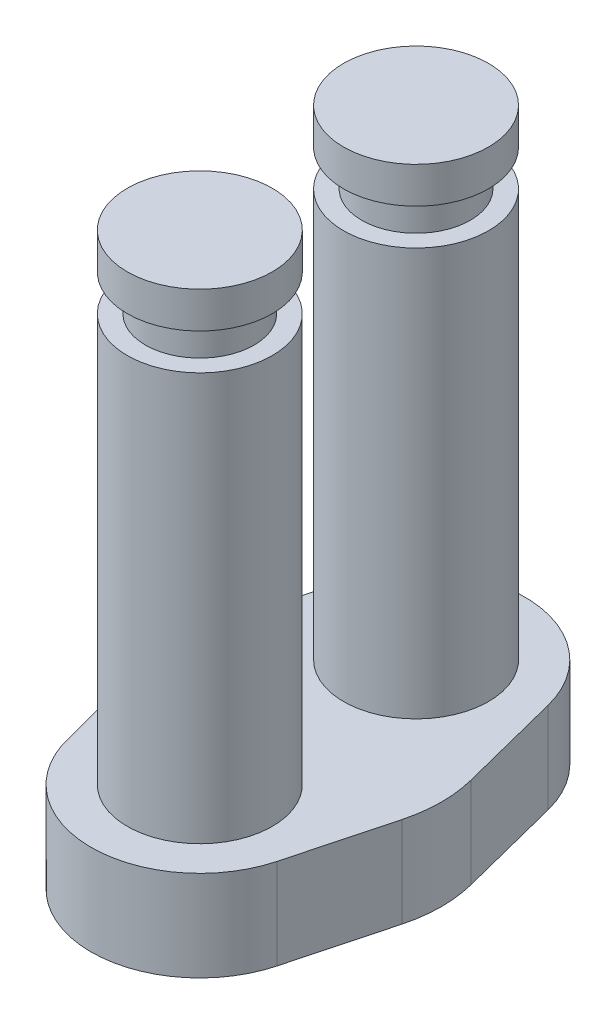
ISO-10303-21;
HEADER;
FILE_DESCRIPTION(('STEP AP214'),'2;1');
FILE_NAME('part.step','',(''),(''),'','','');
FILE_SCHEMA(('AUTOMOTIVE_DESIGN { 1 0 10303 214 1 1 1 1 }'));
ENDSEC;
DATA;
#1=APPLICATION_CONTEXT('core data for automotive mechanical design processes');
#2=APPLICATION_PROTOCOL_DEFINITION('international standard','automotive_design',2000,#1);
#3=PRODUCT_CONTEXT('',#1,'mechanical');
#4=PRODUCT('Part','Part','',(#3));
#5=PRODUCT_RELATED_PRODUCT_CATEGORY('part','',(#4));
#6=PRODUCT_DEFINITION_FORMATION('','',#4);
#7=PRODUCT_DEFINITION_CONTEXT('part definition',#1,'design');
#8=PRODUCT_DEFINITION('design','',#6,#7);
#9=PRODUCT_DEFINITION_SHAPE('','',#8);
#10=(LENGTH_UNIT() NAMED_UNIT(*) SI_UNIT(.MILLI.,.METRE.));
#11=(NAMED_UNIT(*) PLANE_ANGLE_UNIT() SI_UNIT($,.RADIAN.));
#12=(NAMED_UNIT(*) SI_UNIT($,.STERADIAN.) SOLID_ANGLE_UNIT());
#13=UNCERTAINTY_MEASURE_WITH_UNIT(LENGTH_MEASURE(1.E-05),#10,'distance_accuracy_value','');
#14=(GEOMETRIC_REPRESENTATION_CONTEXT(3) GLOBAL_UNCERTAINTY_ASSIGNED_CONTEXT((#13)) GLOBAL_UNIT_ASSIGNED_CONTEXT((#10,
#11,#12)) REPRESENTATION_CONTEXT('',''));
#15=CARTESIAN_POINT('',(0.,0.,0.));
#16=DIRECTION('',(0.,0.,1.));
#17=DIRECTION('',(1.,0.,0.));
#18=AXIS2_PLACEMENT_3D('',#15,#16,#17);
#19=CARTESIAN_POINT('',(10.7914021707681,5.,-2.7425994459952));
#20=DIRECTION('',(-0.969189489495146,0.,0.246316328025849));
#21=DIRECTION('',(0.246316328025849,0.,0.969189489495146));
#22=AXIS2_PLACEMENT_3D('',#19,#20,#21);
#23=PLANE('',#22);
#24=DIRECTION('',(-0.246316328025849,0.,-0.969189489495146));
#25=VECTOR('',#24,1.);
#26=CARTESIAN_POINT('',(10.7914021707681,0.,-2.7425994459952));
#27=LINE('',#26,#25);
#28=CARTESIAN_POINT('',(11.0189211712136,0.,-1.84737246019386));
#29=VERTEX_POINT('',#28);
#30=CARTESIAN_POINT('',(9.56513693697088,0.,-7.56762824313138));
#31=VERTEX_POINT('',#30);
#32=EDGE_CURVE('E132',#29,#31,#27,.T.);
#33=ORIENTED_EDGE('',*,*,#32,.T.);
#34=DIRECTION('',(0.,-1.,0.));
#35=VECTOR('',#34,1.);
#36=CARTESIAN_POINT('',(9.56513693697088,5.,-7.56762824313138));
#37=LINE('',#36,#35);
#38=CARTESIAN_POINT('',(9.56513693697088,5.,-7.56762824313138));
#39=VERTEX_POINT('',#38);
#40=EDGE_CURVE('E37',#39,#31,#37,.T.);
#41=ORIENTED_EDGE('',*,*,#40,.F.);
#42=DIRECTION('',(-0.246316328025849,0.,-0.969189489495146));
#43=VECTOR('',#42,1.);
#44=CARTESIAN_POINT('',(10.7914021707681,5.,-2.7425994459952));
#45=LINE('',#44,#43);
#46=CARTESIAN_POINT('',(11.0189211712136,5.,-1.84737246019386));
#47=VERTEX_POINT('',#46);
#48=EDGE_CURVE('E148',#47,#39,#45,.T.);
#49=ORIENTED_EDGE('',*,*,#48,.F.);
#50=DIRECTION('',(0.,-1.,0.));
#51=VECTOR('',#50,1.);
#52=CARTESIAN_POINT('',(11.0189211712136,5.,-1.84737246019386));
#53=LINE('',#52,#51);
#54=EDGE_CURVE('E128',#47,#29,#53,.T.);
#55=ORIENTED_EDGE('',*,*,#54,.T.);
#56=EDGE_LOOP('',(#33,#41,#49,#55));
#57=FACE_BOUND('',#56,.T.);
#58=ADVANCED_FACE('F34',(#57),#23,.F.);
#59=CARTESIAN_POINT('',(3.75,5.,-6.08973027497629));
#60=DIRECTION('',(0.,-1.,0.));
#61=DIRECTION('',(0.,0.,-1.));
#62=AXIS2_PLACEMENT_3D('',#59,#60,#61);
#63=CYLINDRICAL_SURFACE('',#62,6.);
#64=CARTESIAN_POINT('',(3.75,0.,-6.08973027497629));
#65=DIRECTION('',(0.,1.,0.));
#66=DIRECTION('',(0.,0.,1.));
#67=AXIS2_PLACEMENT_3D('',#64,#65,#66);
#68=CIRCLE('',#67,6.);
#69=CARTESIAN_POINT('',(-2.06513693697088,0.,-7.56762824313138));
#70=VERTEX_POINT('',#69);
#71=EDGE_CURVE('E135',#31,#70,#68,.T.);
#72=ORIENTED_EDGE('',*,*,#71,.T.);
#73=DIRECTION('',(0.,-1.,0.));
#74=VECTOR('',#73,1.);
#75=CARTESIAN_POINT('',(-2.06513693697088,5.,-7.56762824313138));
#76=LINE('',#75,#74);
#77=CARTESIAN_POINT('',(-2.06513693697088,5.,-7.56762824313138));
#78=VERTEX_POINT('',#77);
#79=EDGE_CURVE('E157',#78,#70,#76,.T.);
#80=ORIENTED_EDGE('',*,*,#79,.F.);
#81=CARTESIAN_POINT('',(3.75,5.,-6.08973027497629));
#82=DIRECTION('',(0.,1.,0.));
#83=DIRECTION('',(0.,0.,1.));
#84=AXIS2_PLACEMENT_3D('',#81,#82,#83);
#85=CIRCLE('',#84,6.);
#86=EDGE_CURVE('E92',#39,#78,#85,.T.);
#87=ORIENTED_EDGE('',*,*,#86,.F.);
#88=ORIENTED_EDGE('',*,*,#40,.T.);
#89=EDGE_LOOP('',(#72,#80,#87,#88));
#90=FACE_BOUND('',#89,.T.);
#91=ADVANCED_FACE('F212',(#90),#63,.T.);
#92=CARTESIAN_POINT('',(-3.74644017165911,5.,-0.95214547439252));
#93=DIRECTION('',(0.969189489495147,0.,0.246316328025848));
#94=DIRECTION('',(0.246316328025848,0.,-0.969189489495147));
#95=AXIS2_PLACEMENT_3D('',#92,#93,#94);
#96=PLANE('',#95);
#97=DIRECTION('',(-0.246316328025848,0.,0.969189489495147));
#98=VECTOR('',#97,1.);
#99=CARTESIAN_POINT('',(-3.74644017165911,0.,-0.95214547439252));
#100=LINE('',#99,#98);
#101=CARTESIAN_POINT('',(-3.5189211712136,0.,-1.84737246019386));
#102=VERTEX_POINT('',#101);
#103=EDGE_CURVE('E138',#70,#102,#100,.T.);
#104=ORIENTED_EDGE('',*,*,#103,.T.);
#105=DIRECTION('',(0.,-1.,0.));
#106=VECTOR('',#105,1.);
#107=CARTESIAN_POINT('',(-3.5189211712136,5.,-1.84737246019386));
#108=LINE('',#107,#106);
#109=CARTESIAN_POINT('',(-3.5189211712136,5.,-1.84737246019386));
#110=VERTEX_POINT('',#109);
#111=EDGE_CURVE('E155',#110,#102,#108,.T.);
#112=ORIENTED_EDGE('',*,*,#111,.F.);
#113=DIRECTION('',(-0.246316328025848,0.,0.969189489495147));
#114=VECTOR('',#113,1.);
#115=CARTESIAN_POINT('',(-3.74644017165911,5.,-0.95214547439252));
#116=LINE('',#115,#114);
#117=EDGE_CURVE('E183',#78,#110,#116,.T.);
#118=ORIENTED_EDGE('',*,*,#117,.F.);
#119=ORIENTED_EDGE('',*,*,#79,.T.);
#120=EDGE_LOOP('',(#104,#112,#118,#119));
#121=FACE_BOUND('',#120,.T.);
#122=ADVANCED_FACE('F216',(#121),#96,.F.);
#123=CARTESIAN_POINT('',(3.75,5.,0.));
#124=DIRECTION('',(0.,-1.,0.));
#125=DIRECTION('',(0.,0.,-1.));
#126=AXIS2_PLACEMENT_3D('',#123,#124,#125);
#127=CYLINDRICAL_SURFACE('',#126,7.5);
#128=CARTESIAN_POINT('',(3.75,0.,0.));
#129=DIRECTION('',(0.,1.,0.));
#130=DIRECTION('',(0.,0.,1.));
#131=AXIS2_PLACEMENT_3D('',#128,#129,#130);
#132=CIRCLE('',#131,7.5);
#133=CARTESIAN_POINT('',(-3.49342660554137,0.,1.94493470587972));
#134=VERTEX_POINT('',#133);
#135=EDGE_CURVE('E140',#102,#134,#132,.T.);
#136=ORIENTED_EDGE('',*,*,#135,.T.);
#137=DIRECTION('',(0.,-1.,0.));
#138=VECTOR('',#137,1.);
#139=CARTESIAN_POINT('',(-3.49342660554137,5.,1.94493470587972));
#140=LINE('',#139,#138);
#141=CARTESIAN_POINT('',(-3.49342660554137,5.,1.94493470587972));
#142=VERTEX_POINT('',#141);
#143=EDGE_CURVE('E152',#142,#134,#140,.T.);
#144=ORIENTED_EDGE('',*,*,#143,.F.);
#145=CARTESIAN_POINT('',(3.75,5.,0.));
#146=DIRECTION('',(0.,1.,0.));
#147=DIRECTION('',(0.,0.,1.));
#148=AXIS2_PLACEMENT_3D('',#145,#146,#147);
#149=CIRCLE('',#148,7.5);
#150=EDGE_CURVE('E185',#110,#142,#149,.T.);
#151=ORIENTED_EDGE('',*,*,#150,.F.);
#152=ORIENTED_EDGE('',*,*,#111,.T.);
#153=EDGE_LOOP('',(#136,#144,#151,#152));
#154=FACE_BOUND('',#153,.T.);
#155=ADVANCED_FACE('F190',(#154),#127,.T.);
#156=CARTESIAN_POINT('',(-3.7456113395504,5.,1.00573525290572));
#157=DIRECTION('',(0.965790214072183,0.,-0.259324627450629));
#158=DIRECTION('',(-0.259324627450629,0.,-0.965790214072183));
#159=AXIS2_PLACEMENT_3D('',#156,#157,#158);
#160=PLANE('',#159);
#161=DIRECTION('',(0.259324627450629,0.,0.965790214072183));
#162=VECTOR('',#161,1.);
#163=CARTESIAN_POINT('',(-3.7456113395504,0.,1.00573525290572));
#164=LINE('',#163,#162);
#165=CARTESIAN_POINT('',(-1.92167348288411,0.,7.79853912333431));
#166=VERTEX_POINT('',#165);
#167=EDGE_CURVE('E142',#134,#166,#164,.T.);
#168=ORIENTED_EDGE('',*,*,#167,.T.);
#169=DIRECTION('',(0.,-1.,0.));
#170=VECTOR('',#169,1.);
#171=CARTESIAN_POINT('',(-1.92167348288411,5.,7.79853912333431));
#172=LINE('',#171,#170);
#173=CARTESIAN_POINT('',(-1.92167348288411,5.,7.79853912333431));
#174=VERTEX_POINT('',#173);
#175=EDGE_CURVE('E124',#174,#166,#172,.T.);
#176=ORIENTED_EDGE('',*,*,#175,.F.);
#177=DIRECTION('',(0.259324627450629,0.,0.965790214072183));
#178=VECTOR('',#177,1.);
#179=CARTESIAN_POINT('',(-3.7456113395504,5.,1.00573525290572));
#180=LINE('',#179,#178);
#181=EDGE_CURVE('E111',#142,#174,#180,.T.);
#182=ORIENTED_EDGE('',*,*,#181,.F.);
#183=ORIENTED_EDGE('',*,*,#143,.T.);
#184=EDGE_LOOP('',(#168,#176,#182,#183));
#185=FACE_BOUND('',#184,.T.);
#186=ADVANCED_FACE('F194',(#185),#160,.F.);
#187=CARTESIAN_POINT('',(3.75,5.,5.84095900912463));
#188=DIRECTION('',(0.,-1.,0.));
#189=DIRECTION('',(0.,0.,-1.));
#190=AXIS2_PLACEMENT_3D('',#187,#188,#189);
#191=CYLINDRICAL_SURFACE('',#190,6.);
#192=CARTESIAN_POINT('',(3.75,0.,5.84095900912463));
#193=DIRECTION('',(0.,1.,0.));
#194=DIRECTION('',(0.,0.,1.));
#195=AXIS2_PLACEMENT_3D('',#192,#193,#194);
#196=CIRCLE('',#195,6.);
#197=CARTESIAN_POINT('',(9.54877601505246,0.,7.38180187173338));
#198=VERTEX_POINT('',#197);
#199=EDGE_CURVE('E120',#166,#198,#196,.T.);
#200=ORIENTED_EDGE('',*,*,#199,.T.);
#201=DIRECTION('',(0.,-1.,0.));
#202=VECTOR('',#201,1.);
#203=CARTESIAN_POINT('',(9.54877601505246,5.,7.38180187173338));
#204=LINE('',#203,#202);
#205=CARTESIAN_POINT('',(9.54877601505246,5.,7.38180187173338));
#206=VERTEX_POINT('',#205);
#207=EDGE_CURVE('E117',#206,#198,#204,.T.);
#208=ORIENTED_EDGE('',*,*,#207,.F.);
#209=CARTESIAN_POINT('',(3.75,5.,5.84095900912463));
#210=DIRECTION('',(0.,1.,0.));
#211=DIRECTION('',(0.,0.,1.));
#212=AXIS2_PLACEMENT_3D('',#209,#210,#211);
#213=CIRCLE('',#212,6.);
#214=EDGE_CURVE('E105',#174,#206,#213,.T.);
#215=ORIENTED_EDGE('',*,*,#214,.F.);
#216=ORIENTED_EDGE('',*,*,#175,.T.);
#217=EDGE_LOOP('',(#200,#208,#215,#216));
#218=FACE_BOUND('',#217,.T.);
#219=ADVANCED_FACE('F118',(#218),#191,.T.);
#220=CARTESIAN_POINT('',(10.7511578597268,5.,2.8567830193714));
#221=DIRECTION('',(0.96646266917541,0.,0.256807143768126));
#222=DIRECTION('',(0.256807143768126,0.,-0.96646266917541));
#223=AXIS2_PLACEMENT_3D('',#220,#221,#222);
#224=PLANE('',#223);
#225=DIRECTION('',(-0.256807143768126,0.,0.96646266917541));
#226=VECTOR('',#225,1.);
#227=CARTESIAN_POINT('',(10.7511578597268,0.,2.8567830193714));
#228=LINE('',#227,#226);
#229=CARTESIAN_POINT('',(10.9984700188156,0.,1.92605357826094));
#230=VERTEX_POINT('',#229);
#231=EDGE_CURVE('E145',#230,#198,#228,.T.);
#232=ORIENTED_EDGE('',*,*,#231,.F.);
#233=DIRECTION('',(0.,-1.,0.));
#234=VECTOR('',#233,1.);
#235=CARTESIAN_POINT('',(10.9984700188156,5.,1.92605357826094));
#236=LINE('',#235,#234);
#237=CARTESIAN_POINT('',(10.9984700188156,5.,1.92605357826094));
#238=VERTEX_POINT('',#237);
#239=EDGE_CURVE('E80',#238,#230,#236,.T.);
#240=ORIENTED_EDGE('',*,*,#239,.F.);
#241=DIRECTION('',(-0.256807143768126,0.,0.96646266917541));
#242=VECTOR('',#241,1.);
#243=CARTESIAN_POINT('',(10.7511578597268,5.,2.8567830193714));
#244=LINE('',#243,#242);
#245=EDGE_CURVE('E109',#238,#206,#244,.T.);
#246=ORIENTED_EDGE('',*,*,#245,.T.);
#247=ORIENTED_EDGE('',*,*,#207,.T.);
#248=EDGE_LOOP('',(#232,#240,#246,#247));
#249=FACE_BOUND('',#248,.T.);
#250=ADVANCED_FACE('F126',(#249),#224,.T.);
#251=CARTESIAN_POINT('',(3.75,5.,0.));
#252=DIRECTION('',(0.,-1.,0.));
#253=DIRECTION('',(0.,0.,-1.));
#254=AXIS2_PLACEMENT_3D('',#251,#252,#253);
#255=CYLINDRICAL_SURFACE('',#254,7.5);
#256=CARTESIAN_POINT('',(3.75,0.,0.));
#257=DIRECTION('',(0.,1.,0.));
#258=DIRECTION('',(0.,0.,1.));
#259=AXIS2_PLACEMENT_3D('',#256,#257,#258);
#260=CIRCLE('',#259,7.5);
#261=EDGE_CURVE('E83',#230,#29,#260,.T.);
#262=ORIENTED_EDGE('',*,*,#261,.T.);
#263=ORIENTED_EDGE('',*,*,#54,.F.);
#264=CARTESIAN_POINT('',(3.75,5.,0.));
#265=DIRECTION('',(0.,1.,0.));
#266=DIRECTION('',(0.,0.,1.));
#267=AXIS2_PLACEMENT_3D('',#264,#265,#266);
#268=CIRCLE('',#267,7.5);
#269=EDGE_CURVE('E52',#238,#47,#268,.T.);
#270=ORIENTED_EDGE('',*,*,#269,.F.);
#271=ORIENTED_EDGE('',*,*,#239,.T.);
#272=EDGE_LOOP('',(#262,#263,#270,#271));
#273=FACE_BOUND('',#272,.T.);
#274=ADVANCED_FACE('F200',(#273),#255,.T.);
#275=CARTESIAN_POINT('',(0.,5.,0.));
#276=DIRECTION('',(0.,1.,0.));
#277=DIRECTION('',(0.,0.,1.));
#278=AXIS2_PLACEMENT_3D('',#275,#276,#277);
#279=PLANE('',#278);
#280=CARTESIAN_POINT('',(3.75,5.,-6.08973027497629));
#281=DIRECTION('',(0.,1.,0.));
#282=DIRECTION('',(0.,0.,1.));
#283=AXIS2_PLACEMENT_3D('',#280,#281,#282);
#284=CIRCLE('',#283,4.);
#285=CARTESIAN_POINT('',(3.75,5.,-10.0897302749763));
#286=VERTEX_POINT('',#285);
#287=EDGE_CURVE('E174',#286,#286,#284,.T.);
#288=ORIENTED_EDGE('',*,*,#287,.F.);
#289=EDGE_LOOP('',(#288));
#290=FACE_BOUND('',#289,.T.);
#291=CARTESIAN_POINT('',(3.75,5.,5.84095900912463));
#292=DIRECTION('',(0.,1.,0.));
#293=DIRECTION('',(0.,0.,1.));
#294=AXIS2_PLACEMENT_3D('',#291,#292,#293);
#295=CIRCLE('',#294,4.);
#296=CARTESIAN_POINT('',(3.75,5.,1.84095900912463));
#297=VERTEX_POINT('',#296);
#298=EDGE_CURVE('E173',#297,#297,#295,.T.);
#299=ORIENTED_EDGE('',*,*,#298,.F.);
#300=EDGE_LOOP('',(#299));
#301=FACE_BOUND('',#300,.T.);
#302=ORIENTED_EDGE('',*,*,#48,.T.);
#303=ORIENTED_EDGE('',*,*,#86,.T.);
#304=ORIENTED_EDGE('',*,*,#117,.T.);
#305=ORIENTED_EDGE('',*,*,#150,.T.);
#306=ORIENTED_EDGE('',*,*,#181,.T.);
#307=ORIENTED_EDGE('',*,*,#214,.T.);
#308=ORIENTED_EDGE('',*,*,#245,.F.);
#309=ORIENTED_EDGE('',*,*,#269,.T.);
#310=EDGE_LOOP('',(#302,#303,#304,#305,#306,#307,#308,#309));
#311=FACE_BOUND('',#310,.T.);
#312=ADVANCED_FACE('F107',(#290,#301,#311),#279,.T.);
#313=CARTESIAN_POINT('',(0.,0.,0.));
#314=DIRECTION('',(0.,1.,0.));
#315=DIRECTION('',(0.,0.,1.));
#316=AXIS2_PLACEMENT_3D('',#313,#314,#315);
#317=PLANE('',#316);
#318=CARTESIAN_POINT('',(3.75,0.,-6.08973027497629));
#319=DIRECTION('',(0.,1.,0.));
#320=DIRECTION('',(0.,0.,1.));
#321=AXIS2_PLACEMENT_3D('',#318,#319,#320);
#322=CIRCLE('',#321,1.89865);
#323=CARTESIAN_POINT('',(3.75,0.,-4.19108027497629));
#324=VERTEX_POINT('',#323);
#325=EDGE_CURVE('E424',#324,#324,#322,.T.);
#326=ORIENTED_EDGE('',*,*,#325,.T.);
#327=EDGE_LOOP('',(#326));
#328=FACE_BOUND('',#327,.T.);
#329=CARTESIAN_POINT('',(3.75,0.,5.84095900912463));
#330=DIRECTION('',(0.,1.,0.));
#331=DIRECTION('',(0.,0.,1.));
#332=AXIS2_PLACEMENT_3D('',#329,#330,#331);
#333=CIRCLE('',#332,1.89865);
#334=CARTESIAN_POINT('',(3.75,0.,7.73960900912463));
#335=VERTEX_POINT('',#334);
#336=EDGE_CURVE('E434',#335,#335,#333,.T.);
#337=ORIENTED_EDGE('',*,*,#336,.T.);
#338=EDGE_LOOP('',(#337));
#339=FACE_BOUND('',#338,.T.);
#340=ORIENTED_EDGE('',*,*,#32,.F.);
#341=ORIENTED_EDGE('',*,*,#261,.F.);
#342=ORIENTED_EDGE('',*,*,#231,.T.);
#343=ORIENTED_EDGE('',*,*,#199,.F.);
#344=ORIENTED_EDGE('',*,*,#167,.F.);
#345=ORIENTED_EDGE('',*,*,#135,.F.);
#346=ORIENTED_EDGE('',*,*,#103,.F.);
#347=ORIENTED_EDGE('',*,*,#71,.F.);
#348=EDGE_LOOP('',(#340,#341,#342,#343,#344,#345,#346,#347));
#349=FACE_BOUND('',#348,.T.);
#350=ADVANCED_FACE('F197',(#328,#339,#349),#317,.F.);
#351=CARTESIAN_POINT('',(3.75,27.5,5.84095900912463));
#352=DIRECTION('',(0.,-1.,0.));
#353=DIRECTION('',(0.,0.,-1.));
#354=AXIS2_PLACEMENT_3D('',#351,#352,#353);
#355=CYLINDRICAL_SURFACE('',#354,4.);
#356=CARTESIAN_POINT('',(3.75,27.5,5.84095900912463));
#357=DIRECTION('',(0.,1.,0.));
#358=DIRECTION('',(0.,0.,1.));
#359=AXIS2_PLACEMENT_3D('',#356,#357,#358);
#360=CIRCLE('',#359,4.);
#361=CARTESIAN_POINT('',(3.75,27.5,1.84095900912463));
#362=VERTEX_POINT('',#361);
#363=EDGE_CURVE('E136',#362,#362,#360,.T.);
#364=CARTESIAN_POINT('',(3.75,27.5,1.84095900912463));
#365=CARTESIAN_POINT('',(3.75,27.265625,1.84095900912463));
#366=CARTESIAN_POINT('',(3.75,27.03125,1.84095900912463));
#367=CARTESIAN_POINT('',(3.75,26.5625,1.84095900912463));
#368=CARTESIAN_POINT('',(3.75,26.328125,1.84095900912463));
#369=CARTESIAN_POINT('',(3.75,25.859375,1.84095900912463));
#370=CARTESIAN_POINT('',(3.75,25.625,1.84095900912463));
#371=CARTESIAN_POINT('',(3.75,25.15625,1.84095900912463));
#372=CARTESIAN_POINT('',(3.75,24.921875,1.84095900912463));
#373=CARTESIAN_POINT('',(3.75,24.453125,1.84095900912463));
#374=CARTESIAN_POINT('',(3.75,24.21875,1.84095900912463));
#375=CARTESIAN_POINT('',(3.75,23.75,1.84095900912463));
#376=CARTESIAN_POINT('',(3.75,23.515625,1.84095900912463));
#377=CARTESIAN_POINT('',(3.75,23.046875,1.84095900912463));
#378=CARTESIAN_POINT('',(3.75,22.8125,1.84095900912463));
#379=CARTESIAN_POINT('',(3.75,22.34375,1.84095900912463));
#380=CARTESIAN_POINT('',(3.75,22.109375,1.84095900912463));
#381=CARTESIAN_POINT('',(3.75,21.640625,1.84095900912463));
#382=CARTESIAN_POINT('',(3.75,21.40625,1.84095900912463));
#383=CARTESIAN_POINT('',(3.75,20.9375,1.84095900912463));
#384=CARTESIAN_POINT('',(3.75,20.703125,1.84095900912463));
#385=CARTESIAN_POINT('',(3.75,20.234375,1.84095900912463));
#386=CARTESIAN_POINT('',(3.75,20.,1.84095900912463));
#387=CARTESIAN_POINT('',(3.75,19.53125,1.84095900912463));
#388=CARTESIAN_POINT('',(3.75,19.296875,1.84095900912463));
#389=CARTESIAN_POINT('',(3.75,18.828125,1.84095900912463));
#390=CARTESIAN_POINT('',(3.75,18.59375,1.84095900912463));
#391=CARTESIAN_POINT('',(3.75,18.125,1.84095900912463));
#392=CARTESIAN_POINT('',(3.75,17.890625,1.84095900912463));
#393=CARTESIAN_POINT('',(3.75,17.421875,1.84095900912463));
#394=CARTESIAN_POINT('',(3.75,17.1875,1.84095900912463));
#395=CARTESIAN_POINT('',(3.75,16.71875,1.84095900912463));
#396=CARTESIAN_POINT('',(3.75,16.484375,1.84095900912463));
#397=CARTESIAN_POINT('',(3.75,16.015625,1.84095900912463));
#398=CARTESIAN_POINT('',(3.75,15.78125,1.84095900912463));
#399=CARTESIAN_POINT('',(3.75,15.3125,1.84095900912463));
#400=CARTESIAN_POINT('',(3.75,15.078125,1.84095900912463));
#401=CARTESIAN_POINT('',(3.75,14.609375,1.84095900912463));
#402=CARTESIAN_POINT('',(3.75,14.375,1.84095900912463));
#403=CARTESIAN_POINT('',(3.75,13.90625,1.84095900912463));
#404=CARTESIAN_POINT('',(3.75,13.671875,1.84095900912463));
#405=CARTESIAN_POINT('',(3.75,13.203125,1.84095900912463));
#406=CARTESIAN_POINT('',(3.75,12.96875,1.84095900912463));
#407=CARTESIAN_POINT('',(3.75,12.5,1.84095900912463));
#408=CARTESIAN_POINT('',(3.75,12.265625,1.84095900912463));
#409=CARTESIAN_POINT('',(3.75,11.796875,1.84095900912463));
#410=CARTESIAN_POINT('',(3.75,11.5625,1.84095900912463));
#411=CARTESIAN_POINT('',(3.75,11.09375,1.84095900912463));
#412=CARTESIAN_POINT('',(3.75,10.859375,1.84095900912463));
#413=CARTESIAN_POINT('',(3.75,10.390625,1.84095900912463));
#414=CARTESIAN_POINT('',(3.75,10.15625,1.84095900912463));
#415=CARTESIAN_POINT('',(3.75,9.6875,1.84095900912463));
#416=CARTESIAN_POINT('',(3.75,9.453125,1.84095900912463));
#417=CARTESIAN_POINT('',(3.75,8.984375,1.84095900912463));
#418=CARTESIAN_POINT('',(3.75,8.75,1.84095900912463));
#419=CARTESIAN_POINT('',(3.75,8.28125,1.84095900912463));
#420=CARTESIAN_POINT('',(3.75,8.046875,1.84095900912463));
#421=CARTESIAN_POINT('',(3.75,7.578125,1.84095900912463));
#422=CARTESIAN_POINT('',(3.75,7.34375,1.84095900912463));
#423=CARTESIAN_POINT('',(3.75,6.875,1.84095900912463));
#424=CARTESIAN_POINT('',(3.75,6.640625,1.84095900912463));
#425=CARTESIAN_POINT('',(3.75,6.171875,1.84095900912463));
#426=CARTESIAN_POINT('',(3.75,5.9375,1.84095900912463));
#427=CARTESIAN_POINT('',(3.75,5.46875,1.84095900912463));
#428=CARTESIAN_POINT('',(3.75,5.234375,1.84095900912463));
#429=CARTESIAN_POINT('',(3.75,5.,1.84095900912463));
#430=B_SPLINE_CURVE_WITH_KNOTS('',3,(#364,#365,#366,#367,#368,#369,#370,#371,#372,#373,#374,
#375,#376,#377,#378,#379,#380,#381,#382,#383,#384,#385,#386,#387,#388,#389,#390,#391,#392,#393,
#394,#395,#396,#397,#398,#399,#400,#401,#402,#403,#404,#405,#406,#407,#408,#409,#410,#411,#412,
#413,#414,#415,#416,#417,#418,#419,#420,#421,#422,#423,#424,#425,#426,#427,#428,#429),
.UNSPECIFIED.,.F.,.F.,(4,2,2,2,2,2,2,2,2,2,2,2,2,2,2,2,2,2,2,2,2,2,2,2,2,2,2,2,2,2,2,2,4),(0.,
0.703125000000002,1.40625,2.109375,2.8125,3.515625,4.21875,4.921875,5.625,6.328125,7.03125,
7.734375,8.4375,9.140625,9.84375,10.546875,11.25,11.953125,12.65625,13.359375,14.0625,14.765625,
15.46875,16.171875,16.875,17.578125,18.28125,18.984375,19.6875,20.390625,21.09375,21.796875,
22.5),.UNSPECIFIED.);
#431=EDGE_CURVE('BSEAM254',#362,#297,#430,.T.);
#432=ORIENTED_EDGE('',*,*,#363,.F.);
#433=ORIENTED_EDGE('',*,*,#298,.T.);
#434=ORIENTED_EDGE('',*,*,#431,.T.);
#435=ORIENTED_EDGE('',*,*,#431,.F.);
#436=EDGE_LOOP('',(#432,#434,#433,#435));
#437=FACE_BOUND('',#436,.T.);
#438=ADVANCED_FACE('F254',(#437),#355,.T.);
#439=CARTESIAN_POINT('',(3.75,27.5,5.84095900912463));
#440=DIRECTION('',(0.,1.,0.));
#441=DIRECTION('',(0.,0.,1.));
#442=AXIS2_PLACEMENT_3D('',#439,#440,#441);
#443=PLANE('',#442);
#444=CARTESIAN_POINT('',(3.75,27.5,5.84095900912463));
#445=DIRECTION('',(0.,1.,0.));
#446=DIRECTION('',(0.,0.,1.));
#447=AXIS2_PLACEMENT_3D('',#444,#445,#446);
#448=CIRCLE('',#447,3.);
#449=CARTESIAN_POINT('',(3.75,27.5,8.84095900912463));
#450=VERTEX_POINT('',#449);
#451=EDGE_CURVE('E43',#450,#450,#448,.T.);
#452=ORIENTED_EDGE('',*,*,#451,.F.);
#453=EDGE_LOOP('',(#452));
#454=FACE_BOUND('',#453,.T.);
#455=ORIENTED_EDGE('',*,*,#363,.T.);
#456=EDGE_LOOP('',(#455));
#457=FACE_BOUND('',#456,.T.);
#458=ADVANCED_FACE('F259',(#454,#457),#443,.T.);
#459=CARTESIAN_POINT('',(3.75,27.5,-6.08973027497629));
#460=DIRECTION('',(0.,-1.,0.));
#461=DIRECTION('',(0.,0.,-1.));
#462=AXIS2_PLACEMENT_3D('',#459,#460,#461);
#463=CYLINDRICAL_SURFACE('',#462,4.);
#464=CARTESIAN_POINT('',(3.75,27.5,-6.08973027497629));
#465=DIRECTION('',(0.,1.,0.));
#466=DIRECTION('',(0.,0.,1.));
#467=AXIS2_PLACEMENT_3D('',#464,#465,#466);
#468=CIRCLE('',#467,4.);
#469=CARTESIAN_POINT('',(3.75,27.5,-10.0897302749763));
#470=VERTEX_POINT('',#469);
#471=EDGE_CURVE('E170',#470,#470,#468,.T.);
#472=CARTESIAN_POINT('',(3.75,27.5,-10.0897302749763));
#473=CARTESIAN_POINT('',(3.75,27.265625,-10.0897302749763));
#474=CARTESIAN_POINT('',(3.75,27.03125,-10.0897302749763));
#475=CARTESIAN_POINT('',(3.75,26.5625,-10.0897302749763));
#476=CARTESIAN_POINT('',(3.75,26.328125,-10.0897302749763));
#477=CARTESIAN_POINT('',(3.75,25.859375,-10.0897302749763));
#478=CARTESIAN_POINT('',(3.75,25.625,-10.0897302749763));
#479=CARTESIAN_POINT('',(3.75,25.15625,-10.0897302749763));
#480=CARTESIAN_POINT('',(3.75,24.921875,-10.0897302749763));
#481=CARTESIAN_POINT('',(3.75,24.453125,-10.0897302749763));
#482=CARTESIAN_POINT('',(3.75,24.21875,-10.0897302749763));
#483=CARTESIAN_POINT('',(3.75,23.75,-10.0897302749763));
#484=CARTESIAN_POINT('',(3.75,23.515625,-10.0897302749763));
#485=CARTESIAN_POINT('',(3.75,23.046875,-10.0897302749763));
#486=CARTESIAN_POINT('',(3.75,22.8125,-10.0897302749763));
#487=CARTESIAN_POINT('',(3.75,22.34375,-10.0897302749763));
#488=CARTESIAN_POINT('',(3.75,22.109375,-10.0897302749763));
#489=CARTESIAN_POINT('',(3.75,21.640625,-10.0897302749763));
#490=CARTESIAN_POINT('',(3.75,21.40625,-10.0897302749763));
#491=CARTESIAN_POINT('',(3.75,20.9375,-10.0897302749763));
#492=CARTESIAN_POINT('',(3.75,20.703125,-10.0897302749763));
#493=CARTESIAN_POINT('',(3.75,20.234375,-10.0897302749763));
#494=CARTESIAN_POINT('',(3.75,20.,-10.0897302749763));
#495=CARTESIAN_POINT('',(3.75,19.53125,-10.0897302749763));
#496=CARTESIAN_POINT('',(3.75,19.296875,-10.0897302749763));
#497=CARTESIAN_POINT('',(3.75,18.828125,-10.0897302749763));
#498=CARTESIAN_POINT('',(3.75,18.59375,-10.0897302749763));
#499=CARTESIAN_POINT('',(3.75,18.125,-10.0897302749763));
#500=CARTESIAN_POINT('',(3.75,17.890625,-10.0897302749763));
#501=CARTESIAN_POINT('',(3.75,17.421875,-10.0897302749763));
#502=CARTESIAN_POINT('',(3.75,17.1875,-10.0897302749763));
#503=CARTESIAN_POINT('',(3.75,16.71875,-10.0897302749763));
#504=CARTESIAN_POINT('',(3.75,16.484375,-10.0897302749763));
#505=CARTESIAN_POINT('',(3.75,16.015625,-10.0897302749763));
#506=CARTESIAN_POINT('',(3.75,15.78125,-10.0897302749763));
#507=CARTESIAN_POINT('',(3.75,15.3125,-10.0897302749763));
#508=CARTESIAN_POINT('',(3.75,15.078125,-10.0897302749763));
#509=CARTESIAN_POINT('',(3.75,14.609375,-10.0897302749763));
#510=CARTESIAN_POINT('',(3.75,14.375,-10.0897302749763));
#511=CARTESIAN_POINT('',(3.75,13.90625,-10.0897302749763));
#512=CARTESIAN_POINT('',(3.75,13.671875,-10.0897302749763));
#513=CARTESIAN_POINT('',(3.75,13.203125,-10.0897302749763));
#514=CARTESIAN_POINT('',(3.75,12.96875,-10.0897302749763));
#515=CARTESIAN_POINT('',(3.75,12.5,-10.0897302749763));
#516=CARTESIAN_POINT('',(3.75,12.265625,-10.0897302749763));
#517=CARTESIAN_POINT('',(3.75,11.796875,-10.0897302749763));
#518=CARTESIAN_POINT('',(3.75,11.5625,-10.0897302749763));
#519=CARTESIAN_POINT('',(3.75,11.09375,-10.0897302749763));
#520=CARTESIAN_POINT('',(3.75,10.859375,-10.0897302749763));
#521=CARTESIAN_POINT('',(3.75,10.390625,-10.0897302749763));
#522=CARTESIAN_POINT('',(3.75,10.15625,-10.0897302749763));
#523=CARTESIAN_POINT('',(3.75,9.6875,-10.0897302749763));
#524=CARTESIAN_POINT('',(3.75,9.453125,-10.0897302749763));
#525=CARTESIAN_POINT('',(3.75,8.984375,-10.0897302749763));
#526=CARTESIAN_POINT('',(3.75,8.75,-10.0897302749763));
#527=CARTESIAN_POINT('',(3.75,8.28125,-10.0897302749763));
#528=CARTESIAN_POINT('',(3.75,8.046875,-10.0897302749763));
#529=CARTESIAN_POINT('',(3.75,7.578125,-10.0897302749763));
#530=CARTESIAN_POINT('',(3.75,7.34375,-10.0897302749763));
#531=CARTESIAN_POINT('',(3.75,6.875,-10.0897302749763));
#532=CARTESIAN_POINT('',(3.75,6.640625,-10.0897302749763));
#533=CARTESIAN_POINT('',(3.75,6.171875,-10.0897302749763));
#534=CARTESIAN_POINT('',(3.75,5.9375,-10.0897302749763));
#535=CARTESIAN_POINT('',(3.75,5.46875,-10.0897302749763));
#536=CARTESIAN_POINT('',(3.75,5.234375,-10.0897302749763));
#537=CARTESIAN_POINT('',(3.75,5.,-10.0897302749763));
#538=B_SPLINE_CURVE_WITH_KNOTS('',3,(#472,#473,#474,#475,#476,#477,#478,#479,#480,#481,#482,
#483,#484,#485,#486,#487,#488,#489,#490,#491,#492,#493,#494,#495,#496,#497,#498,#499,#500,#501,
#502,#503,#504,#505,#506,#507,#508,#509,#510,#511,#512,#513,#514,#515,#516,#517,#518,#519,#520,
#521,#522,#523,#524,#525,#526,#527,#528,#529,#530,#531,#532,#533,#534,#535,#536,#537),
.UNSPECIFIED.,.F.,.F.,(4,2,2,2,2,2,2,2,2,2,2,2,2,2,2,2,2,2,2,2,2,2,2,2,2,2,2,2,2,2,2,2,4),(0.,
0.703125000000002,1.40625,2.109375,2.8125,3.515625,4.21875,4.921875,5.625,6.328125,7.03125,
7.734375,8.4375,9.140625,9.84375,10.546875,11.25,11.953125,12.65625,13.359375,14.0625,14.765625,
15.46875,16.171875,16.875,17.578125,18.28125,18.984375,19.6875,20.390625,21.09375,21.796875,
22.5),.UNSPECIFIED.);
#539=EDGE_CURVE('BSEAM268',#470,#286,#538,.T.);
#540=ORIENTED_EDGE('',*,*,#471,.F.);
#541=ORIENTED_EDGE('',*,*,#287,.T.);
#542=ORIENTED_EDGE('',*,*,#539,.T.);
#543=ORIENTED_EDGE('',*,*,#539,.F.);
#544=EDGE_LOOP('',(#540,#542,#541,#543));
#545=FACE_BOUND('',#544,.T.);
#546=ADVANCED_FACE('F268',(#545),#463,.T.);
#547=CARTESIAN_POINT('',(3.75,27.5,-6.08973027497629));
#548=DIRECTION('',(0.,1.,0.));
#549=DIRECTION('',(0.,0.,1.));
#550=AXIS2_PLACEMENT_3D('',#547,#548,#549);
#551=PLANE('',#550);
#552=CARTESIAN_POINT('',(3.75,27.5,-6.08973027497629));
#553=DIRECTION('',(0.,1.,0.));
#554=DIRECTION('',(0.,0.,1.));
#555=AXIS2_PLACEMENT_3D('',#552,#553,#554);
#556=CIRCLE('',#555,3.);
#557=CARTESIAN_POINT('',(3.75,27.5,-3.08973027497629));
#558=VERTEX_POINT('',#557);
#559=EDGE_CURVE('E11',#558,#558,#556,.T.);
#560=ORIENTED_EDGE('',*,*,#559,.F.);
#561=EDGE_LOOP('',(#560));
#562=FACE_BOUND('',#561,.T.);
#563=ORIENTED_EDGE('',*,*,#471,.T.);
#564=EDGE_LOOP('',(#563));
#565=FACE_BOUND('',#564,.T.);
#566=ADVANCED_FACE('F273',(#562,#565),#551,.T.);
#567=CARTESIAN_POINT('',(3.75,29.5,5.84095900912463));
#568=DIRECTION('',(0.,-1.,0.));
#569=DIRECTION('',(0.,0.,-1.));
#570=AXIS2_PLACEMENT_3D('',#567,#568,#569);
#571=CYLINDRICAL_SURFACE('',#570,3.);
#572=CARTESIAN_POINT('',(3.75,29.5,5.84095900912463));
#573=DIRECTION('',(0.,1.,0.));
#574=DIRECTION('',(0.,0.,1.));
#575=AXIS2_PLACEMENT_3D('',#572,#573,#574);
#576=CIRCLE('',#575,3.);
#577=CARTESIAN_POINT('',(3.75,29.5,8.84095900912463));
#578=VERTEX_POINT('',#577);
#579=EDGE_CURVE('E169',#578,#578,#576,.T.);
#580=ORIENTED_EDGE('',*,*,#579,.F.);
#581=EDGE_LOOP('',(#580));
#582=FACE_BOUND('',#581,.T.);
#583=ORIENTED_EDGE('',*,*,#451,.T.);
#584=EDGE_LOOP('',(#583));
#585=FACE_BOUND('',#584,.T.);
#586=ADVANCED_FACE('F290',(#582,#585),#571,.T.);
#587=CARTESIAN_POINT('',(3.75,29.5,-6.08973027497629));
#588=DIRECTION('',(0.,-1.,0.));
#589=DIRECTION('',(0.,0.,-1.));
#590=AXIS2_PLACEMENT_3D('',#587,#588,#589);
#591=CYLINDRICAL_SURFACE('',#590,3.);
#592=CARTESIAN_POINT('',(3.75,29.5,-6.08973027497629));
#593=DIRECTION('',(0.,1.,0.));
#594=DIRECTION('',(0.,0.,1.));
#595=AXIS2_PLACEMENT_3D('',#592,#593,#594);
#596=CIRCLE('',#595,3.);
#597=CARTESIAN_POINT('',(3.75,29.5,-3.08973027497629));
#598=VERTEX_POINT('',#597);
#599=EDGE_CURVE('E447',#598,#598,#596,.T.);
#600=ORIENTED_EDGE('',*,*,#599,.F.);
#601=EDGE_LOOP('',(#600));
#602=FACE_BOUND('',#601,.T.);
#603=ORIENTED_EDGE('',*,*,#559,.T.);
#604=EDGE_LOOP('',(#603));
#605=FACE_BOUND('',#604,.T.);
#606=ADVANCED_FACE('F300',(#602,#605),#591,.T.);
#607=CARTESIAN_POINT('',(3.75,31.5,5.84095900912463));
#608=DIRECTION('',(0.,-1.,0.));
#609=DIRECTION('',(0.,0.,-1.));
#610=AXIS2_PLACEMENT_3D('',#607,#608,#609);
#611=CYLINDRICAL_SURFACE('',#610,4.);
#612=CARTESIAN_POINT('',(3.75,31.5,5.84095900912463));
#613=DIRECTION('',(0.,1.,0.));
#614=DIRECTION('',(0.,0.,1.));
#615=AXIS2_PLACEMENT_3D('',#612,#613,#614);
#616=CIRCLE('',#615,4.);
#617=CARTESIAN_POINT('',(3.75,31.5,9.84095900912463));
#618=VERTEX_POINT('',#617);
#619=EDGE_CURVE('E444',#618,#618,#616,.T.);
#620=ORIENTED_EDGE('',*,*,#619,.F.);
#621=EDGE_LOOP('',(#620));
#622=FACE_BOUND('',#621,.T.);
#623=CARTESIAN_POINT('',(3.75,29.5,5.84095900912463));
#624=DIRECTION('',(0.,1.,0.));
#625=DIRECTION('',(0.,0.,1.));
#626=AXIS2_PLACEMENT_3D('',#623,#624,#625);
#627=CIRCLE('',#626,4.);
#628=CARTESIAN_POINT('',(3.75,29.5,9.84095900912463));
#629=VERTEX_POINT('',#628);
#630=EDGE_CURVE('E441',#629,#629,#627,.T.);
#631=ORIENTED_EDGE('',*,*,#630,.T.);
#632=EDGE_LOOP('',(#631));
#633=FACE_BOUND('',#632,.T.);
#634=ADVANCED_FACE('F310',(#622,#633),#611,.T.);
#635=CARTESIAN_POINT('',(3.75,31.5,5.84095900912463));
#636=DIRECTION('',(0.,1.,0.));
#637=DIRECTION('',(0.,0.,1.));
#638=AXIS2_PLACEMENT_3D('',#635,#636,#637);
#639=PLANE('',#638);
#640=ORIENTED_EDGE('',*,*,#619,.T.);
#641=EDGE_LOOP('',(#640));
#642=FACE_BOUND('',#641,.T.);
#643=ADVANCED_FACE('F320',(#642),#639,.T.);
#644=CARTESIAN_POINT('',(3.75,29.5,5.84095900912463));
#645=DIRECTION('',(0.,1.,0.));
#646=DIRECTION('',(0.,0.,1.));
#647=AXIS2_PLACEMENT_3D('',#644,#645,#646);
#648=PLANE('',#647);
#649=ORIENTED_EDGE('',*,*,#579,.T.);
#650=EDGE_LOOP('',(#649));
#651=FACE_BOUND('',#650,.T.);
#652=ORIENTED_EDGE('',*,*,#630,.F.);
#653=EDGE_LOOP('',(#652));
#654=FACE_BOUND('',#653,.T.);
#655=ADVANCED_FACE('F330',(#651,#654),#648,.F.);
#656=CARTESIAN_POINT('',(3.75,31.5,-6.08973027497629));
#657=DIRECTION('',(0.,-1.,0.));
#658=DIRECTION('',(0.,0.,-1.));
#659=AXIS2_PLACEMENT_3D('',#656,#657,#658);
#660=CYLINDRICAL_SURFACE('',#659,4.);
#661=CARTESIAN_POINT('',(3.75,31.5,-6.08973027497629));
#662=DIRECTION('',(0.,1.,0.));
#663=DIRECTION('',(0.,0.,1.));
#664=AXIS2_PLACEMENT_3D('',#661,#662,#663);
#665=CIRCLE('',#664,4.);
#666=CARTESIAN_POINT('',(3.75,31.5,-2.08973027497629));
#667=VERTEX_POINT('',#666);
#668=EDGE_CURVE('E438',#667,#667,#665,.T.);
#669=ORIENTED_EDGE('',*,*,#668,.F.);
#670=EDGE_LOOP('',(#669));
#671=FACE_BOUND('',#670,.T.);
#672=CARTESIAN_POINT('',(3.75,29.5,-6.08973027497629));
#673=DIRECTION('',(0.,1.,0.));
#674=DIRECTION('',(0.,0.,1.));
#675=AXIS2_PLACEMENT_3D('',#672,#673,#674);
#676=CIRCLE('',#675,4.);
#677=CARTESIAN_POINT('',(3.75,29.5,-2.08973027497629));
#678=VERTEX_POINT('',#677);
#679=EDGE_CURVE('E437',#678,#678,#676,.T.);
#680=ORIENTED_EDGE('',*,*,#679,.T.);
#681=EDGE_LOOP('',(#680));
#682=FACE_BOUND('',#681,.T.);
#683=ADVANCED_FACE('F340',(#671,#682),#660,.T.);
#684=CARTESIAN_POINT('',(3.75,31.5,-6.08973027497629));
#685=DIRECTION('',(0.,1.,0.));
#686=DIRECTION('',(0.,0.,1.));
#687=AXIS2_PLACEMENT_3D('',#684,#685,#686);
#688=PLANE('',#687);
#689=ORIENTED_EDGE('',*,*,#668,.T.);
#690=EDGE_LOOP('',(#689));
#691=FACE_BOUND('',#690,.T.);
#692=ADVANCED_FACE('F350',(#691),#688,.T.);
#693=CARTESIAN_POINT('',(3.75,29.5,-6.08973027497629));
#694=DIRECTION('',(0.,1.,0.));
#695=DIRECTION('',(0.,0.,1.));
#696=AXIS2_PLACEMENT_3D('',#693,#694,#695);
#697=PLANE('',#696);
#698=ORIENTED_EDGE('',*,*,#599,.T.);
#699=EDGE_LOOP('',(#698));
#700=FACE_BOUND('',#699,.T.);
#701=ORIENTED_EDGE('',*,*,#679,.F.);
#702=EDGE_LOOP('',(#701));
#703=FACE_BOUND('',#702,.T.);
#704=ADVANCED_FACE('F360',(#700,#703),#697,.F.);
#705=CARTESIAN_POINT('',(5.64864999999999,5.,5.84095900912463));
#706=DIRECTION('',(0.,1.,0.));
#707=DIRECTION('',(0.,0.,1.));
#708=AXIS2_PLACEMENT_3D('',#705,#706,#707);
#709=PLANE('',#708);
#710=CARTESIAN_POINT('',(3.75,5.,5.84095900912463));
#711=DIRECTION('',(0.,1.,0.));
#712=DIRECTION('',(0.,0.,1.));
#713=AXIS2_PLACEMENT_3D('',#710,#711,#712);
#714=CIRCLE('',#713,1.89864999999999);
#715=CARTESIAN_POINT('',(3.75,5.,7.73960900912462));
#716=VERTEX_POINT('',#715);
#717=EDGE_CURVE('E429',#716,#716,#714,.T.);
#718=ORIENTED_EDGE('',*,*,#717,.F.);
#719=EDGE_LOOP('',(#718));
#720=FACE_BOUND('',#719,.T.);
#721=ADVANCED_FACE('F370',(#720),#709,.F.);
#722=CARTESIAN_POINT('',(3.75,5.,5.84095900912463));
#723=DIRECTION('',(0.,1.,0.));
#724=DIRECTION('',(0.,0.,1.));
#725=AXIS2_PLACEMENT_3D('',#722,#723,#724);
#726=CYLINDRICAL_SURFACE('',#725,1.89864999999999);
#727=ORIENTED_EDGE('',*,*,#336,.F.);
#728=EDGE_LOOP('',(#727));
#729=FACE_BOUND('',#728,.T.);
#730=ORIENTED_EDGE('',*,*,#717,.T.);
#731=EDGE_LOOP('',(#730));
#732=FACE_BOUND('',#731,.T.);
#733=ADVANCED_FACE('F387',(#729,#732),#726,.F.);
#734=CARTESIAN_POINT('',(5.64864999999999,5.,-6.08973027497629));
#735=DIRECTION('',(0.,1.,0.));
#736=DIRECTION('',(0.,0.,1.));
#737=AXIS2_PLACEMENT_3D('',#734,#735,#736);
#738=PLANE('',#737);
#739=CARTESIAN_POINT('',(3.75,5.,-6.08973027497629));
#740=DIRECTION('',(0.,1.,0.));
#741=DIRECTION('',(0.,0.,1.));
#742=AXIS2_PLACEMENT_3D('',#739,#740,#741);
#743=CIRCLE('',#742,1.89864999999999);
#744=CARTESIAN_POINT('',(3.75,5.,-4.1910802749763));
#745=VERTEX_POINT('',#744);
#746=EDGE_CURVE('E427',#745,#745,#743,.T.);
#747=ORIENTED_EDGE('',*,*,#746,.F.);
#748=EDGE_LOOP('',(#747));
#749=FACE_BOUND('',#748,.T.);
#750=ADVANCED_FACE('F397',(#749),#738,.F.);
#751=CARTESIAN_POINT('',(3.75,5.,-6.08973027497629));
#752=DIRECTION('',(0.,1.,0.));
#753=DIRECTION('',(0.,0.,1.));
#754=AXIS2_PLACEMENT_3D('',#751,#752,#753);
#755=CYLINDRICAL_SURFACE('',#754,1.89864999999999);
#756=ORIENTED_EDGE('',*,*,#325,.F.);
#757=EDGE_LOOP('',(#756));
#758=FACE_BOUND('',#757,.T.);
#759=ORIENTED_EDGE('',*,*,#746,.T.);
#760=EDGE_LOOP('',(#759));
#761=FACE_BOUND('',#760,.T.);
#762=ADVANCED_FACE('F407',(#758,#761),#755,.F.);
#763=CLOSED_SHELL('',(#58,#91,#122,#155,#186,#219,#250,#274,#312,#350,#438,#458,#546,#566,#586,
#606,#634,#643,#655,#683,#692,#704,#721,#733,#750,#762));
#764=MANIFOLD_SOLID_BREP('B2',#763);
#765=ADVANCED_BREP_SHAPE_REPRESENTATION('',(#18,#764),#14);
#766=SHAPE_DEFINITION_REPRESENTATION(#9,#765);
ENDSEC;
END-ISO-10303-21;
